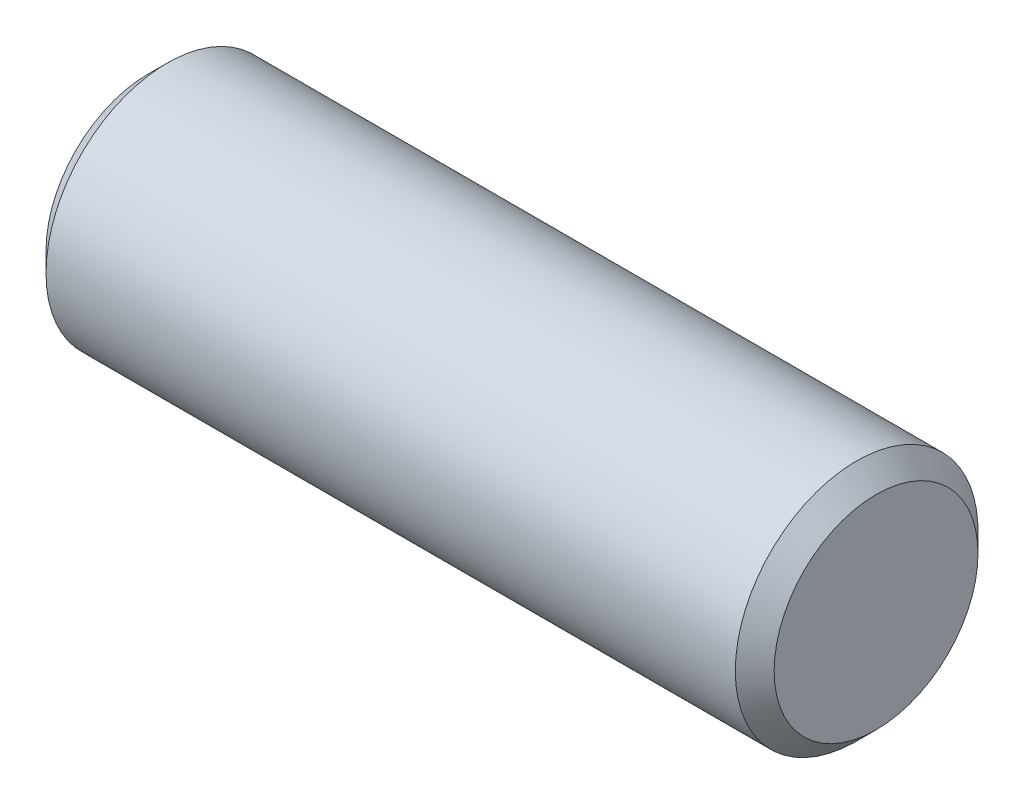
ISO-10303-21;
HEADER;
FILE_DESCRIPTION(('STEP AP214'),'2;1');
FILE_NAME('part.step','',(''),(''),'','','');
FILE_SCHEMA(('AUTOMOTIVE_DESIGN { 1 0 10303 214 1 1 1 1 }'));
ENDSEC;
DATA;
#1=APPLICATION_CONTEXT('core data for automotive mechanical design processes');
#2=APPLICATION_PROTOCOL_DEFINITION('international standard','automotive_design',2000,#1);
#3=PRODUCT_CONTEXT('',#1,'mechanical');
#4=PRODUCT('Part','Part','',(#3));
#5=PRODUCT_RELATED_PRODUCT_CATEGORY('part','',(#4));
#6=PRODUCT_DEFINITION_FORMATION('','',#4);
#7=PRODUCT_DEFINITION_CONTEXT('part definition',#1,'design');
#8=PRODUCT_DEFINITION('design','',#6,#7);
#9=PRODUCT_DEFINITION_SHAPE('','',#8);
#10=(LENGTH_UNIT() NAMED_UNIT(*) SI_UNIT(.MILLI.,.METRE.));
#11=(NAMED_UNIT(*) PLANE_ANGLE_UNIT() SI_UNIT($,.RADIAN.));
#12=(NAMED_UNIT(*) SI_UNIT($,.STERADIAN.) SOLID_ANGLE_UNIT());
#13=UNCERTAINTY_MEASURE_WITH_UNIT(LENGTH_MEASURE(1.E-05),#10,'distance_accuracy_value','');
#14=(GEOMETRIC_REPRESENTATION_CONTEXT(3) GLOBAL_UNCERTAINTY_ASSIGNED_CONTEXT((#13)) GLOBAL_UNIT_ASSIGNED_CONTEXT((#10,
#11,#12)) REPRESENTATION_CONTEXT('',''));
#15=CARTESIAN_POINT('',(0.,0.,0.));
#16=DIRECTION('',(0.,0.,1.));
#17=DIRECTION('',(1.,0.,0.));
#18=AXIS2_PLACEMENT_3D('',#15,#16,#17);
#19=CARTESIAN_POINT('',(9.525,0.,0.));
#20=DIRECTION('',(1.,0.,0.));
#21=DIRECTION('',(0.,0.,-1.));
#22=AXIS2_PLACEMENT_3D('',#19,#20,#21);
#23=PLANE('',#22);
#24=CARTESIAN_POINT('',(9.52499999999645,0.,0.));
#25=DIRECTION('',(-1.,0.,0.));
#26=DIRECTION('',(0.,0.,1.));
#27=AXIS2_PLACEMENT_3D('',#24,#25,#26);
#28=CIRCLE('',#27,1.333499999987);
#29=CARTESIAN_POINT('',(9.52499999999645,0.,1.333499999987));
#30=VERTEX_POINT('',#29);
#31=EDGE_CURVE('E18',#30,#30,#28,.T.);
#32=ORIENTED_EDGE('',*,*,#31,.F.);
#33=EDGE_LOOP('',(#32));
#34=FACE_BOUND('',#33,.T.);
#35=ADVANCED_FACE('F15',(#34),#23,.T.);
#36=CARTESIAN_POINT('',(0.,0.,0.));
#37=DIRECTION('',(1.,0.,0.));
#38=DIRECTION('',(0.,0.,-1.));
#39=AXIS2_PLACEMENT_3D('',#36,#37,#38);
#40=PLANE('',#39);
#41=CARTESIAN_POINT('',(-5.6843418860808E-11,0.,0.));
#42=DIRECTION('',(1.,0.,0.));
#43=DIRECTION('',(0.,0.,-1.));
#44=AXIS2_PLACEMENT_3D('',#41,#42,#43);
#45=CIRCLE('',#44,1.33350000004384);
#46=CARTESIAN_POINT('',(-5.6843418860808E-11,0.,-1.33350000004384));
#47=VERTEX_POINT('',#46);
#48=EDGE_CURVE('E27',#47,#47,#45,.T.);
#49=ORIENTED_EDGE('',*,*,#48,.F.);
#50=EDGE_LOOP('',(#49));
#51=FACE_BOUND('',#50,.T.);
#52=ADVANCED_FACE('F38',(#51),#40,.F.);
#53=CARTESIAN_POINT('',(9.27100000001246,0.,0.));
#54=DIRECTION('',(-1.,0.,0.));
#55=DIRECTION('',(0.,0.,1.));
#56=AXIS2_PLACEMENT_3D('',#53,#54,#55);
#57=CONICAL_SURFACE('',#56,1.58749999997099,0.785398163397448);
#58=CARTESIAN_POINT('',(9.271,0.,0.));
#59=DIRECTION('',(-1.,0.,0.));
#60=DIRECTION('',(0.,0.,1.));
#61=AXIS2_PLACEMENT_3D('',#58,#59,#60);
#62=CIRCLE('',#61,1.5875);
#63=CARTESIAN_POINT('',(9.271,0.,1.5875));
#64=VERTEX_POINT('',#63);
#65=EDGE_CURVE('E22',#64,#64,#62,.T.);
#66=ORIENTED_EDGE('',*,*,#65,.F.);
#67=EDGE_LOOP('',(#66));
#68=FACE_BOUND('',#67,.T.);
#69=ORIENTED_EDGE('',*,*,#31,.T.);
#70=EDGE_LOOP('',(#69));
#71=FACE_BOUND('',#70,.T.);
#72=ADVANCED_FACE('F35',(#68,#71),#57,.T.);
#73=CARTESIAN_POINT('',(0.253999999927146,0.,0.));
#74=DIRECTION('',(1.,0.,0.));
#75=DIRECTION('',(0.,0.,-1.));
#76=AXIS2_PLACEMENT_3D('',#73,#74,#75);
#77=CONICAL_SURFACE('',#76,1.58749999997099,0.785398163285552);
#78=CARTESIAN_POINT('',(0.254000000000004,0.,0.));
#79=DIRECTION('',(-1.,0.,0.));
#80=DIRECTION('',(0.,0.,1.));
#81=AXIS2_PLACEMENT_3D('',#78,#79,#80);
#82=CIRCLE('',#81,1.5875);
#83=CARTESIAN_POINT('',(0.254000000000004,0.,1.5875));
#84=VERTEX_POINT('',#83);
#85=EDGE_CURVE('E10',#84,#84,#82,.F.);
#86=ORIENTED_EDGE('',*,*,#85,.F.);
#87=EDGE_LOOP('',(#86));
#88=FACE_BOUND('',#87,.T.);
#89=ORIENTED_EDGE('',*,*,#48,.T.);
#90=EDGE_LOOP('',(#89));
#91=FACE_BOUND('',#90,.T.);
#92=ADVANCED_FACE('F46',(#88,#91),#77,.T.);
#93=CARTESIAN_POINT('',(9.525,0.,0.));
#94=DIRECTION('',(-1.,0.,0.));
#95=DIRECTION('',(0.,0.,1.));
#96=AXIS2_PLACEMENT_3D('',#93,#94,#95);
#97=CYLINDRICAL_SURFACE('',#96,1.5875);
#98=ORIENTED_EDGE('',*,*,#85,.T.);
#99=EDGE_LOOP('',(#98));
#100=FACE_BOUND('',#99,.T.);
#101=ORIENTED_EDGE('',*,*,#65,.T.);
#102=EDGE_LOOP('',(#101));
#103=FACE_BOUND('',#102,.T.);
#104=ADVANCED_FACE('F44',(#100,#103),#97,.T.);
#105=CLOSED_SHELL('',(#35,#52,#72,#92,#104));
#106=MANIFOLD_SOLID_BREP('B1',#105);
#107=ADVANCED_BREP_SHAPE_REPRESENTATION('',(#18,#106),#14);
#108=SHAPE_DEFINITION_REPRESENTATION(#9,#107);
ENDSEC;
END-ISO-10303-21;
